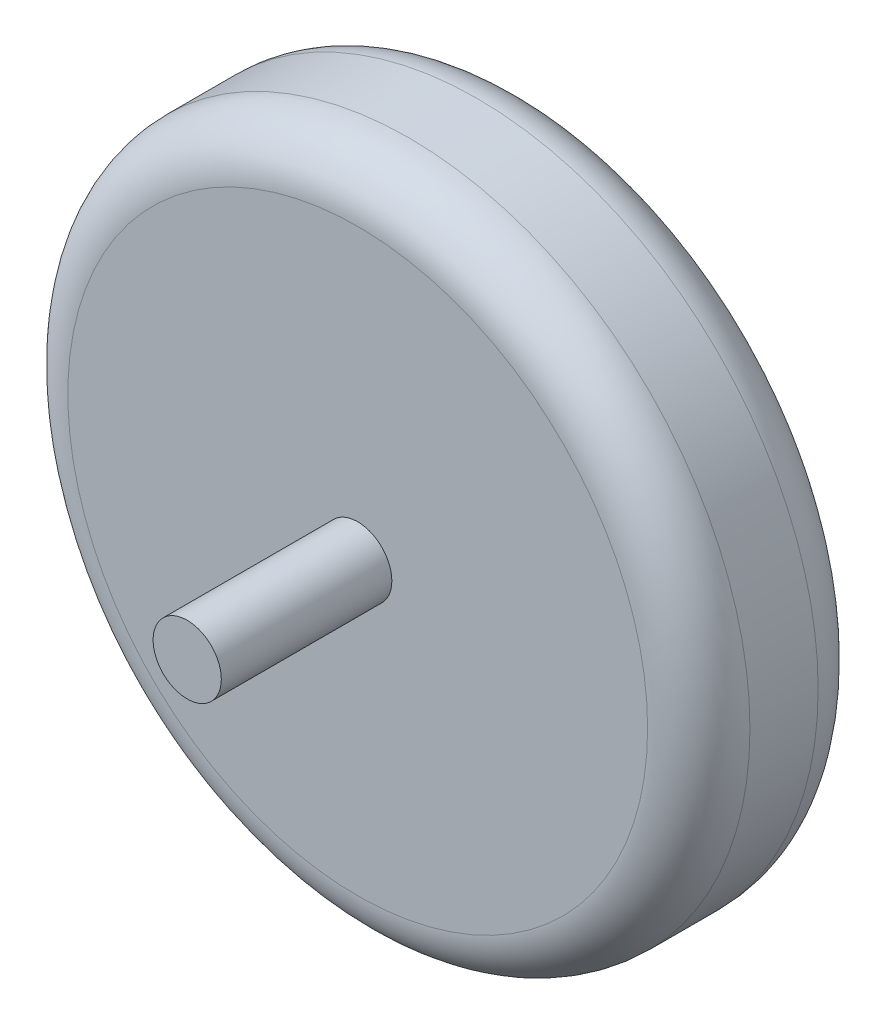
ISO-10303-21;
HEADER;
FILE_DESCRIPTION(('STEP AP214'),'2;1');
FILE_NAME('part.step','',(''),(''),'','','');
FILE_SCHEMA(('AUTOMOTIVE_DESIGN { 1 0 10303 214 1 1 1 1 }'));
ENDSEC;
DATA;
#1=APPLICATION_CONTEXT('core data for automotive mechanical design processes');
#2=APPLICATION_PROTOCOL_DEFINITION('international standard','automotive_design',2000,#1);
#3=PRODUCT_CONTEXT('',#1,'mechanical');
#4=PRODUCT('Part','Part','',(#3));
#5=PRODUCT_RELATED_PRODUCT_CATEGORY('part','',(#4));
#6=PRODUCT_DEFINITION_FORMATION('','',#4);
#7=PRODUCT_DEFINITION_CONTEXT('part definition',#1,'design');
#8=PRODUCT_DEFINITION('design','',#6,#7);
#9=PRODUCT_DEFINITION_SHAPE('','',#8);
#10=(LENGTH_UNIT() NAMED_UNIT(*) SI_UNIT(.MILLI.,.METRE.));
#11=(NAMED_UNIT(*) PLANE_ANGLE_UNIT() SI_UNIT($,.RADIAN.));
#12=(NAMED_UNIT(*) SI_UNIT($,.STERADIAN.) SOLID_ANGLE_UNIT());
#13=UNCERTAINTY_MEASURE_WITH_UNIT(LENGTH_MEASURE(1.E-05),#10,'distance_accuracy_value','');
#14=(GEOMETRIC_REPRESENTATION_CONTEXT(3) GLOBAL_UNCERTAINTY_ASSIGNED_CONTEXT((#13)) GLOBAL_UNIT_ASSIGNED_CONTEXT((#10,
#11,#12)) REPRESENTATION_CONTEXT('',''));
#15=CARTESIAN_POINT('',(0.,0.,0.));
#16=DIRECTION('',(0.,0.,1.));
#17=DIRECTION('',(1.,0.,0.));
#18=AXIS2_PLACEMENT_3D('',#15,#16,#17);
#19=CARTESIAN_POINT('',(0.,0.,50.));
#20=DIRECTION('',(0.,0.,-1.));
#21=DIRECTION('',(-1.,0.,0.));
#22=AXIS2_PLACEMENT_3D('',#19,#20,#21);
#23=CYLINDRICAL_SURFACE('',#22,100.);
#24=CARTESIAN_POINT('',(0.,0.,15.));
#25=DIRECTION('',(0.,0.,1.));
#26=DIRECTION('',(1.,0.,0.));
#27=AXIS2_PLACEMENT_3D('',#24,#25,#26);
#28=CIRCLE('',#27,100.);
#29=CARTESIAN_POINT('',(100.,0.,15.));
#30=VERTEX_POINT('',#29);
#31=EDGE_CURVE('E48',#30,#30,#28,.T.);
#32=ORIENTED_EDGE('',*,*,#31,.T.);
#33=EDGE_LOOP('',(#32));
#34=FACE_BOUND('',#33,.T.);
#35=CARTESIAN_POINT('',(0.,0.,35.));
#36=DIRECTION('',(0.,0.,1.));
#37=DIRECTION('',(1.,0.,0.));
#38=AXIS2_PLACEMENT_3D('',#35,#36,#37);
#39=CIRCLE('',#38,100.);
#40=CARTESIAN_POINT('',(100.,0.,35.));
#41=VERTEX_POINT('',#40);
#42=EDGE_CURVE('E52',#41,#41,#39,.F.);
#43=ORIENTED_EDGE('',*,*,#42,.T.);
#44=EDGE_LOOP('',(#43));
#45=FACE_BOUND('',#44,.T.);
#46=ADVANCED_FACE('F37',(#34,#45),#23,.T.);
#47=CARTESIAN_POINT('',(0.,0.,50.));
#48=DIRECTION('',(0.,0.,1.));
#49=DIRECTION('',(1.,0.,0.));
#50=AXIS2_PLACEMENT_3D('',#47,#48,#49);
#51=PLANE('',#50);
#52=CARTESIAN_POINT('',(0.,0.,50.));
#53=DIRECTION('',(0.,0.,1.));
#54=DIRECTION('',(1.,0.,0.));
#55=AXIS2_PLACEMENT_3D('',#52,#53,#54);
#56=CIRCLE('',#55,85.);
#57=CARTESIAN_POINT('',(85.,0.,50.));
#58=VERTEX_POINT('',#57);
#59=EDGE_CURVE('E10',#58,#58,#56,.T.);
#60=ORIENTED_EDGE('',*,*,#59,.T.);
#61=EDGE_LOOP('',(#60));
#62=FACE_BOUND('',#61,.T.);
#63=CARTESIAN_POINT('',(0.,0.,50.));
#64=DIRECTION('',(0.,0.,1.));
#65=DIRECTION('',(1.,0.,0.));
#66=AXIS2_PLACEMENT_3D('',#63,#64,#65);
#67=CIRCLE('',#66,10.);
#68=CARTESIAN_POINT('',(10.,0.,50.));
#69=VERTEX_POINT('',#68);
#70=EDGE_CURVE('E58',#69,#69,#67,.T.);
#71=ORIENTED_EDGE('',*,*,#70,.F.);
#72=EDGE_LOOP('',(#71));
#73=FACE_BOUND('',#72,.T.);
#74=ADVANCED_FACE('F73',(#62,#73),#51,.T.);
#75=CARTESIAN_POINT('',(0.,0.,0.));
#76=DIRECTION('',(0.,0.,1.));
#77=DIRECTION('',(1.,0.,0.));
#78=AXIS2_PLACEMENT_3D('',#75,#76,#77);
#79=PLANE('',#78);
#80=CARTESIAN_POINT('',(0.,0.,0.));
#81=DIRECTION('',(0.,0.,1.));
#82=DIRECTION('',(1.,0.,0.));
#83=AXIS2_PLACEMENT_3D('',#80,#81,#82);
#84=CIRCLE('',#83,85.);
#85=CARTESIAN_POINT('',(85.,0.,0.));
#86=VERTEX_POINT('',#85);
#87=EDGE_CURVE('E44',#86,#86,#84,.F.);
#88=ORIENTED_EDGE('',*,*,#87,.T.);
#89=EDGE_LOOP('',(#88));
#90=FACE_BOUND('',#89,.T.);
#91=ADVANCED_FACE('F69',(#90),#79,.F.);
#92=CARTESIAN_POINT('',(0.,0.,100.));
#93=DIRECTION('',(0.,0.,-1.));
#94=DIRECTION('',(-1.,0.,0.));
#95=AXIS2_PLACEMENT_3D('',#92,#93,#94);
#96=CYLINDRICAL_SURFACE('',#95,10.);
#97=CARTESIAN_POINT('',(0.,0.,100.));
#98=DIRECTION('',(0.,0.,1.));
#99=DIRECTION('',(1.,0.,0.));
#100=AXIS2_PLACEMENT_3D('',#97,#98,#99);
#101=CIRCLE('',#100,10.);
#102=CARTESIAN_POINT('',(10.,0.,100.));
#103=VERTEX_POINT('',#102);
#104=EDGE_CURVE('E57',#103,#103,#101,.T.);
#105=ORIENTED_EDGE('',*,*,#104,.F.);
#106=EDGE_LOOP('',(#105));
#107=FACE_BOUND('',#106,.T.);
#108=ORIENTED_EDGE('',*,*,#70,.T.);
#109=EDGE_LOOP('',(#108));
#110=FACE_BOUND('',#109,.T.);
#111=ADVANCED_FACE('F66',(#107,#110),#96,.T.);
#112=CARTESIAN_POINT('',(0.,0.,100.));
#113=DIRECTION('',(0.,0.,1.));
#114=DIRECTION('',(1.,0.,0.));
#115=AXIS2_PLACEMENT_3D('',#112,#113,#114);
#116=PLANE('',#115);
#117=ORIENTED_EDGE('',*,*,#104,.T.);
#118=EDGE_LOOP('',(#117));
#119=FACE_BOUND('',#118,.T.);
#120=ADVANCED_FACE('F64',(#119),#116,.T.);
#121=CARTESIAN_POINT('',(0.,0.,15.));
#122=DIRECTION('',(0.,0.,1.));
#123=DIRECTION('',(1.,0.,0.));
#124=AXIS2_PLACEMENT_3D('',#121,#122,#123);
#125=TOROIDAL_SURFACE('',#124,85.,15.);
#126=ORIENTED_EDGE('',*,*,#87,.F.);
#127=EDGE_LOOP('',(#126));
#128=FACE_BOUND('',#127,.T.);
#129=ORIENTED_EDGE('',*,*,#31,.F.);
#130=EDGE_LOOP('',(#129));
#131=FACE_BOUND('',#130,.T.);
#132=ADVANCED_FACE('F84',(#128,#131),#125,.T.);
#133=CARTESIAN_POINT('',(0.,0.,35.));
#134=DIRECTION('',(0.,0.,1.));
#135=DIRECTION('',(1.,0.,0.));
#136=AXIS2_PLACEMENT_3D('',#133,#134,#135);
#137=TOROIDAL_SURFACE('',#136,85.,15.);
#138=ORIENTED_EDGE('',*,*,#42,.F.);
#139=EDGE_LOOP('',(#138));
#140=FACE_BOUND('',#139,.T.);
#141=ORIENTED_EDGE('',*,*,#59,.F.);
#142=EDGE_LOOP('',(#141));
#143=FACE_BOUND('',#142,.T.);
#144=ADVANCED_FACE('F39',(#140,#143),#137,.T.);
#145=CLOSED_SHELL('',(#46,#74,#91,#111,#120,#132,#144));
#146=MANIFOLD_SOLID_BREP('B2',#145);
#147=ADVANCED_BREP_SHAPE_REPRESENTATION('',(#18,#146),#14);
#148=SHAPE_DEFINITION_REPRESENTATION(#9,#147);
ENDSEC;
END-ISO-10303-21;
